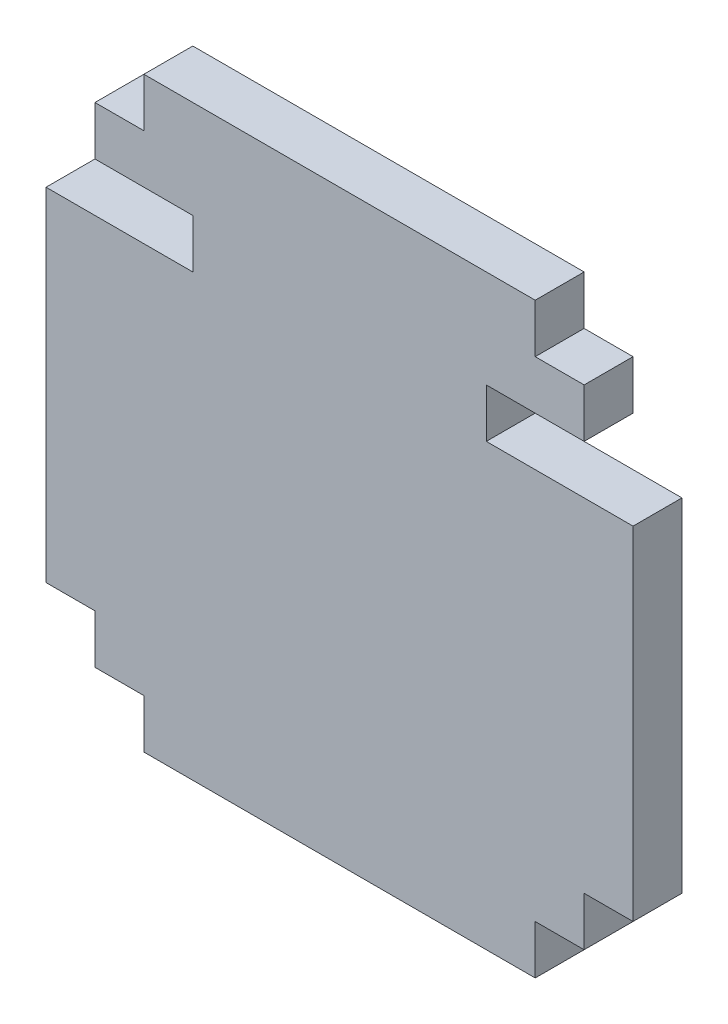
ISO-10303-21;
HEADER;
FILE_DESCRIPTION(('STEP AP214'),'2;1');
FILE_NAME('part.step','',(''),(''),'','','');
FILE_SCHEMA(('AUTOMOTIVE_DESIGN { 1 0 10303 214 1 1 1 1 }'));
ENDSEC;
DATA;
#1=APPLICATION_CONTEXT('core data for automotive mechanical design processes');
#2=APPLICATION_PROTOCOL_DEFINITION('international standard','automotive_design',2000,#1);
#3=PRODUCT_CONTEXT('',#1,'mechanical');
#4=PRODUCT('Part','Part','',(#3));
#5=PRODUCT_RELATED_PRODUCT_CATEGORY('part','',(#4));
#6=PRODUCT_DEFINITION_FORMATION('','',#4);
#7=PRODUCT_DEFINITION_CONTEXT('part definition',#1,'design');
#8=PRODUCT_DEFINITION('design','',#6,#7);
#9=PRODUCT_DEFINITION_SHAPE('','',#8);
#10=(LENGTH_UNIT() NAMED_UNIT(*) SI_UNIT(.MILLI.,.METRE.));
#11=(NAMED_UNIT(*) PLANE_ANGLE_UNIT() SI_UNIT($,.RADIAN.));
#12=(NAMED_UNIT(*) SI_UNIT($,.STERADIAN.) SOLID_ANGLE_UNIT());
#13=UNCERTAINTY_MEASURE_WITH_UNIT(LENGTH_MEASURE(1.E-05),#10,'distance_accuracy_value','');
#14=(GEOMETRIC_REPRESENTATION_CONTEXT(3) GLOBAL_UNCERTAINTY_ASSIGNED_CONTEXT((#13)) GLOBAL_UNIT_ASSIGNED_CONTEXT((#10,
#11,#12)) REPRESENTATION_CONTEXT('',''));
#15=CARTESIAN_POINT('',(0.,0.,0.));
#16=DIRECTION('',(0.,0.,1.));
#17=DIRECTION('',(1.,0.,0.));
#18=AXIS2_PLACEMENT_3D('',#15,#16,#17);
#19=CARTESIAN_POINT('',(0.,0.,0.));
#20=DIRECTION('',(0.,0.,1.));
#21=DIRECTION('',(1.,0.,0.));
#22=AXIS2_PLACEMENT_3D('',#19,#20,#21);
#23=PLANE('',#22);
#24=DIRECTION('',(0.,1.,0.));
#25=VECTOR('',#24,1.);
#26=CARTESIAN_POINT('',(-19.05,60.325,0.));
#27=LINE('',#26,#25);
#28=CARTESIAN_POINT('',(-19.05,53.975,0.));
#29=VERTEX_POINT('',#28);
#30=CARTESIAN_POINT('',(-19.05,60.325,0.));
#31=VERTEX_POINT('',#30);
#32=EDGE_CURVE('E205',#29,#31,#27,.T.);
#33=ORIENTED_EDGE('',*,*,#32,.T.);
#34=DIRECTION('',(-1.,0.,0.));
#35=VECTOR('',#34,1.);
#36=CARTESIAN_POINT('',(-38.1,60.325,0.));
#37=LINE('',#36,#35);
#38=CARTESIAN_POINT('',(-31.75,60.325,0.));
#39=VERTEX_POINT('',#38);
#40=EDGE_CURVE('E206',#31,#39,#37,.T.);
#41=ORIENTED_EDGE('',*,*,#40,.T.);
#42=DIRECTION('',(0.,-1.,0.));
#43=VECTOR('',#42,1.);
#44=CARTESIAN_POINT('',(-31.75,66.675,0.));
#45=LINE('',#44,#43);
#46=CARTESIAN_POINT('',(-31.75,66.675,0.));
#47=VERTEX_POINT('',#46);
#48=EDGE_CURVE('E220',#47,#39,#45,.T.);
#49=ORIENTED_EDGE('',*,*,#48,.F.);
#50=DIRECTION('',(-1.,0.,0.));
#51=VECTOR('',#50,1.);
#52=CARTESIAN_POINT('',(-25.4,66.675,0.));
#53=LINE('',#52,#51);
#54=CARTESIAN_POINT('',(-25.4,66.675,0.));
#55=VERTEX_POINT('',#54);
#56=EDGE_CURVE('E225',#55,#47,#53,.T.);
#57=ORIENTED_EDGE('',*,*,#56,.F.);
#58=DIRECTION('',(0.,-1.,0.));
#59=VECTOR('',#58,1.);
#60=CARTESIAN_POINT('',(-25.4,73.025,0.));
#61=LINE('',#60,#59);
#62=CARTESIAN_POINT('',(-25.4,73.025,0.));
#63=VERTEX_POINT('',#62);
#64=EDGE_CURVE('E356',#63,#55,#61,.T.);
#65=ORIENTED_EDGE('',*,*,#64,.F.);
#66=DIRECTION('',(-1.,0.,0.));
#67=VECTOR('',#66,1.);
#68=CARTESIAN_POINT('',(25.4,73.025,0.));
#69=LINE('',#68,#67);
#70=CARTESIAN_POINT('',(25.4,73.025,0.));
#71=VERTEX_POINT('',#70);
#72=EDGE_CURVE('E353',#71,#63,#69,.T.);
#73=ORIENTED_EDGE('',*,*,#72,.F.);
#74=DIRECTION('',(0.,1.,0.));
#75=VECTOR('',#74,1.);
#76=CARTESIAN_POINT('',(25.4,66.675,0.));
#77=LINE('',#76,#75);
#78=CARTESIAN_POINT('',(25.4,66.675,0.));
#79=VERTEX_POINT('',#78);
#80=EDGE_CURVE('E350',#79,#71,#77,.T.);
#81=ORIENTED_EDGE('',*,*,#80,.F.);
#82=DIRECTION('',(-1.,0.,0.));
#83=VECTOR('',#82,1.);
#84=CARTESIAN_POINT('',(31.75,66.675,0.));
#85=LINE('',#84,#83);
#86=CARTESIAN_POINT('',(31.75,66.675,0.));
#87=VERTEX_POINT('',#86);
#88=EDGE_CURVE('E347',#87,#79,#85,.T.);
#89=ORIENTED_EDGE('',*,*,#88,.F.);
#90=DIRECTION('',(0.,1.,0.));
#91=VECTOR('',#90,1.);
#92=CARTESIAN_POINT('',(31.75,60.325,0.));
#93=LINE('',#92,#91);
#94=CARTESIAN_POINT('',(31.75,60.325,0.));
#95=VERTEX_POINT('',#94);
#96=EDGE_CURVE('E344',#95,#87,#93,.T.);
#97=ORIENTED_EDGE('',*,*,#96,.F.);
#98=DIRECTION('',(-1.,0.,0.));
#99=VECTOR('',#98,1.);
#100=CARTESIAN_POINT('',(38.1,60.325,0.));
#101=LINE('',#100,#99);
#102=CARTESIAN_POINT('',(19.05,60.325,0.));
#103=VERTEX_POINT('',#102);
#104=EDGE_CURVE('E394',#95,#103,#101,.T.);
#105=ORIENTED_EDGE('',*,*,#104,.T.);
#106=DIRECTION('',(0.,-1.,0.));
#107=VECTOR('',#106,1.);
#108=CARTESIAN_POINT('',(19.05,60.325,0.));
#109=LINE('',#108,#107);
#110=CARTESIAN_POINT('',(19.05,53.975,0.));
#111=VERTEX_POINT('',#110);
#112=EDGE_CURVE('E421',#103,#111,#109,.T.);
#113=ORIENTED_EDGE('',*,*,#112,.T.);
#114=DIRECTION('',(1.,0.,0.));
#115=VECTOR('',#114,1.);
#116=CARTESIAN_POINT('',(19.05,53.975,0.));
#117=LINE('',#116,#115);
#118=CARTESIAN_POINT('',(38.1,53.975,0.));
#119=VERTEX_POINT('',#118);
#120=EDGE_CURVE('E412',#111,#119,#117,.T.);
#121=ORIENTED_EDGE('',*,*,#120,.T.);
#122=DIRECTION('',(0.,1.,0.));
#123=VECTOR('',#122,1.);
#124=CARTESIAN_POINT('',(38.1,9.52500000000001,0.));
#125=LINE('',#124,#123);
#126=CARTESIAN_POINT('',(38.1,9.52500000000001,0.));
#127=VERTEX_POINT('',#126);
#128=EDGE_CURVE('E341',#127,#119,#125,.T.);
#129=ORIENTED_EDGE('',*,*,#128,.F.);
#130=DIRECTION('',(1.,0.,0.));
#131=VECTOR('',#130,1.);
#132=CARTESIAN_POINT('',(31.75,9.52500000000001,0.));
#133=LINE('',#132,#131);
#134=CARTESIAN_POINT('',(31.75,9.52500000000001,0.));
#135=VERTEX_POINT('',#134);
#136=EDGE_CURVE('E338',#135,#127,#133,.T.);
#137=ORIENTED_EDGE('',*,*,#136,.F.);
#138=DIRECTION('',(0.,1.,0.));
#139=VECTOR('',#138,1.);
#140=CARTESIAN_POINT('',(31.75,3.175,0.));
#141=LINE('',#140,#139);
#142=CARTESIAN_POINT('',(31.75,3.175,0.));
#143=VERTEX_POINT('',#142);
#144=EDGE_CURVE('E335',#143,#135,#141,.T.);
#145=ORIENTED_EDGE('',*,*,#144,.F.);
#146=DIRECTION('',(1.,0.,0.));
#147=VECTOR('',#146,1.);
#148=CARTESIAN_POINT('',(25.4,3.175,0.));
#149=LINE('',#148,#147);
#150=CARTESIAN_POINT('',(25.4,3.175,0.));
#151=VERTEX_POINT('',#150);
#152=EDGE_CURVE('E332',#151,#143,#149,.T.);
#153=ORIENTED_EDGE('',*,*,#152,.F.);
#154=DIRECTION('',(0.,1.,0.));
#155=VECTOR('',#154,1.);
#156=CARTESIAN_POINT('',(25.4,-3.175,0.));
#157=LINE('',#156,#155);
#158=CARTESIAN_POINT('',(25.4,-3.175,0.));
#159=VERTEX_POINT('',#158);
#160=EDGE_CURVE('E329',#159,#151,#157,.T.);
#161=ORIENTED_EDGE('',*,*,#160,.F.);
#162=DIRECTION('',(1.,0.,0.));
#163=VECTOR('',#162,1.);
#164=CARTESIAN_POINT('',(-25.4,-3.175,0.));
#165=LINE('',#164,#163);
#166=CARTESIAN_POINT('',(-25.4,-3.175,0.));
#167=VERTEX_POINT('',#166);
#168=EDGE_CURVE('E325',#167,#159,#165,.T.);
#169=ORIENTED_EDGE('',*,*,#168,.F.);
#170=DIRECTION('',(0.,-1.,0.));
#171=VECTOR('',#170,1.);
#172=CARTESIAN_POINT('',(-25.4,-3.175,0.));
#173=LINE('',#172,#171);
#174=CARTESIAN_POINT('',(-25.4,3.175,0.));
#175=VERTEX_POINT('',#174);
#176=EDGE_CURVE('E322',#175,#167,#173,.T.);
#177=ORIENTED_EDGE('',*,*,#176,.F.);
#178=DIRECTION('',(1.,0.,0.));
#179=VECTOR('',#178,1.);
#180=CARTESIAN_POINT('',(-25.4,3.175,0.));
#181=LINE('',#180,#179);
#182=CARTESIAN_POINT('',(-31.75,3.175,0.));
#183=VERTEX_POINT('',#182);
#184=EDGE_CURVE('E231',#183,#175,#181,.T.);
#185=ORIENTED_EDGE('',*,*,#184,.F.);
#186=DIRECTION('',(0.,-1.,0.));
#187=VECTOR('',#186,1.);
#188=CARTESIAN_POINT('',(-31.75,3.175,0.));
#189=LINE('',#188,#187);
#190=CARTESIAN_POINT('',(-31.75,9.525,0.));
#191=VERTEX_POINT('',#190);
#192=EDGE_CURVE('E222',#191,#183,#189,.T.);
#193=ORIENTED_EDGE('',*,*,#192,.F.);
#194=DIRECTION('',(1.,0.,0.));
#195=VECTOR('',#194,1.);
#196=CARTESIAN_POINT('',(-31.75,9.525,0.));
#197=LINE('',#196,#195);
#198=CARTESIAN_POINT('',(-38.1,9.525,0.));
#199=VERTEX_POINT('',#198);
#200=EDGE_CURVE('E219',#199,#191,#197,.T.);
#201=ORIENTED_EDGE('',*,*,#200,.F.);
#202=DIRECTION('',(0.,-1.,0.));
#203=VECTOR('',#202,1.);
#204=CARTESIAN_POINT('',(-38.1,9.525,0.));
#205=LINE('',#204,#203);
#206=CARTESIAN_POINT('',(-38.1,53.975,0.));
#207=VERTEX_POINT('',#206);
#208=EDGE_CURVE('E212',#207,#199,#205,.T.);
#209=ORIENTED_EDGE('',*,*,#208,.F.);
#210=DIRECTION('',(1.,0.,0.));
#211=VECTOR('',#210,1.);
#212=CARTESIAN_POINT('',(-19.05,53.975,0.));
#213=LINE('',#212,#211);
#214=EDGE_CURVE('E198',#207,#29,#213,.T.);
#215=ORIENTED_EDGE('',*,*,#214,.T.);
#216=EDGE_LOOP('',(#33,#41,#49,#57,#65,#73,#81,#89,#97,#105,#113,#121,#129,#137,#145,#153,#161,
#169,#177,#185,#193,#201,#209,#215));
#217=FACE_BOUND('',#216,.T.);
#218=ADVANCED_FACE('F33',(#217),#23,.F.);
#219=CARTESIAN_POINT('',(-25.4,3.175,114.11307345283));
#220=DIRECTION('',(0.,1.,0.));
#221=DIRECTION('',(0.,0.,1.));
#222=AXIS2_PLACEMENT_3D('',#219,#220,#221);
#223=PLANE('',#222);
#224=DIRECTION('',(0.,0.,-1.));
#225=VECTOR('',#224,1.);
#226=CARTESIAN_POINT('',(-25.4,3.175,114.11307345283));
#227=LINE('',#226,#225);
#228=CARTESIAN_POINT('',(-25.4,3.175,6.35000000000002));
#229=VERTEX_POINT('',#228);
#230=EDGE_CURVE('E234',#229,#175,#227,.T.);
#231=ORIENTED_EDGE('',*,*,#230,.F.);
#232=DIRECTION('',(-1.,0.,0.));
#233=VECTOR('',#232,1.);
#234=CARTESIAN_POINT('',(-25.4,3.175,6.35000000000002));
#235=LINE('',#234,#233);
#236=CARTESIAN_POINT('',(-31.75,3.175,6.35000000000005));
#237=VERTEX_POINT('',#236);
#238=EDGE_CURVE('E270',#229,#237,#235,.T.);
#239=ORIENTED_EDGE('',*,*,#238,.T.);
#240=DIRECTION('',(0.,0.,-1.));
#241=VECTOR('',#240,1.);
#242=CARTESIAN_POINT('',(-31.75,3.175,114.11307345283));
#243=LINE('',#242,#241);
#244=EDGE_CURVE('E236',#237,#183,#243,.T.);
#245=ORIENTED_EDGE('',*,*,#244,.T.);
#246=ORIENTED_EDGE('',*,*,#184,.T.);
#247=EDGE_LOOP('',(#231,#239,#245,#246));
#248=FACE_BOUND('',#247,.T.);
#249=ADVANCED_FACE('F450',(#248),#223,.F.);
#250=CARTESIAN_POINT('',(-31.75,3.175,114.11307345283));
#251=DIRECTION('',(1.,0.,0.));
#252=DIRECTION('',(0.,0.,-1.));
#253=AXIS2_PLACEMENT_3D('',#250,#251,#252);
#254=PLANE('',#253);
#255=ORIENTED_EDGE('',*,*,#244,.F.);
#256=DIRECTION('',(0.,1.,0.));
#257=VECTOR('',#256,1.);
#258=CARTESIAN_POINT('',(-31.75,3.175,6.35000000000002));
#259=LINE('',#258,#257);
#260=CARTESIAN_POINT('',(-31.75,9.525,6.35000000000002));
#261=VERTEX_POINT('',#260);
#262=EDGE_CURVE('E272',#237,#261,#259,.T.);
#263=ORIENTED_EDGE('',*,*,#262,.T.);
#264=DIRECTION('',(0.,0.,-1.));
#265=VECTOR('',#264,1.);
#266=CARTESIAN_POINT('',(-31.75,9.525,114.11307345283));
#267=LINE('',#266,#265);
#268=EDGE_CURVE('E238',#261,#191,#267,.T.);
#269=ORIENTED_EDGE('',*,*,#268,.T.);
#270=ORIENTED_EDGE('',*,*,#192,.T.);
#271=EDGE_LOOP('',(#255,#263,#269,#270));
#272=FACE_BOUND('',#271,.T.);
#273=ADVANCED_FACE('F457',(#272),#254,.F.);
#274=CARTESIAN_POINT('',(-31.75,9.525,114.11307345283));
#275=DIRECTION('',(0.,1.,0.));
#276=DIRECTION('',(0.,0.,1.));
#277=AXIS2_PLACEMENT_3D('',#274,#275,#276);
#278=PLANE('',#277);
#279=ORIENTED_EDGE('',*,*,#268,.F.);
#280=DIRECTION('',(-1.,0.,0.));
#281=VECTOR('',#280,1.);
#282=CARTESIAN_POINT('',(-31.75,9.525,6.35000000000002));
#283=LINE('',#282,#281);
#284=CARTESIAN_POINT('',(-38.1,9.525,6.35000000000002));
#285=VERTEX_POINT('',#284);
#286=EDGE_CURVE('E57',#261,#285,#283,.T.);
#287=ORIENTED_EDGE('',*,*,#286,.T.);
#288=DIRECTION('',(0.,0.,-1.));
#289=VECTOR('',#288,1.);
#290=CARTESIAN_POINT('',(-38.1,9.525,114.11307345283));
#291=LINE('',#290,#289);
#292=EDGE_CURVE('E240',#285,#199,#291,.T.);
#293=ORIENTED_EDGE('',*,*,#292,.T.);
#294=ORIENTED_EDGE('',*,*,#200,.T.);
#295=EDGE_LOOP('',(#279,#287,#293,#294));
#296=FACE_BOUND('',#295,.T.);
#297=ADVANCED_FACE('F464',(#296),#278,.F.);
#298=CARTESIAN_POINT('',(-38.1,9.525,114.11307345283));
#299=DIRECTION('',(1.,0.,0.));
#300=DIRECTION('',(0.,0.,-1.));
#301=AXIS2_PLACEMENT_3D('',#298,#299,#300);
#302=PLANE('',#301);
#303=DIRECTION('',(0.,1.,0.));
#304=VECTOR('',#303,1.);
#305=CARTESIAN_POINT('',(-38.1,9.525,6.35000000000002));
#306=LINE('',#305,#304);
#307=CARTESIAN_POINT('',(-38.1,53.975,6.35000000000002));
#308=VERTEX_POINT('',#307);
#309=EDGE_CURVE('E214',#285,#308,#306,.T.);
#310=ORIENTED_EDGE('',*,*,#309,.T.);
#311=DIRECTION('',(0.,0.,1.));
#312=VECTOR('',#311,1.);
#313=CARTESIAN_POINT('',(-38.1,53.975,0.));
#314=LINE('',#313,#312);
#315=EDGE_CURVE('E48',#207,#308,#314,.T.);
#316=ORIENTED_EDGE('',*,*,#315,.F.);
#317=ORIENTED_EDGE('',*,*,#208,.T.);
#318=ORIENTED_EDGE('',*,*,#292,.F.);
#319=EDGE_LOOP('',(#310,#316,#317,#318));
#320=FACE_BOUND('',#319,.T.);
#321=ADVANCED_FACE('F210',(#320),#302,.F.);
#322=CARTESIAN_POINT('',(-31.75,66.675,114.11307345283));
#323=DIRECTION('',(1.,0.,0.));
#324=DIRECTION('',(0.,0.,-1.));
#325=AXIS2_PLACEMENT_3D('',#322,#323,#324);
#326=PLANE('',#325);
#327=DIRECTION('',(0.,0.,-1.));
#328=VECTOR('',#327,1.);
#329=CARTESIAN_POINT('',(-31.75,60.325,114.11307345283));
#330=LINE('',#329,#328);
#331=CARTESIAN_POINT('',(-31.75,60.325,6.35000000000002));
#332=VERTEX_POINT('',#331);
#333=EDGE_CURVE('E242',#332,#39,#330,.T.);
#334=ORIENTED_EDGE('',*,*,#333,.F.);
#335=DIRECTION('',(0.,1.,0.));
#336=VECTOR('',#335,1.);
#337=CARTESIAN_POINT('',(-31.75,66.675,6.35000000000002));
#338=LINE('',#337,#336);
#339=CARTESIAN_POINT('',(-31.75,66.675,6.35000000000002));
#340=VERTEX_POINT('',#339);
#341=EDGE_CURVE('E285',#332,#340,#338,.T.);
#342=ORIENTED_EDGE('',*,*,#341,.T.);
#343=DIRECTION('',(0.,0.,-1.));
#344=VECTOR('',#343,1.);
#345=CARTESIAN_POINT('',(-31.75,66.675,114.11307345283));
#346=LINE('',#345,#344);
#347=EDGE_CURVE('E244',#340,#47,#346,.T.);
#348=ORIENTED_EDGE('',*,*,#347,.T.);
#349=ORIENTED_EDGE('',*,*,#48,.T.);
#350=EDGE_LOOP('',(#334,#342,#348,#349));
#351=FACE_BOUND('',#350,.T.);
#352=ADVANCED_FACE('F370',(#351),#326,.F.);
#353=CARTESIAN_POINT('',(-25.4,66.675,114.11307345283));
#354=DIRECTION('',(0.,-1.,0.));
#355=DIRECTION('',(0.,0.,-1.));
#356=AXIS2_PLACEMENT_3D('',#353,#354,#355);
#357=PLANE('',#356);
#358=ORIENTED_EDGE('',*,*,#347,.F.);
#359=DIRECTION('',(1.,0.,0.));
#360=VECTOR('',#359,1.);
#361=CARTESIAN_POINT('',(-25.4,66.675,6.35000000000002));
#362=LINE('',#361,#360);
#363=CARTESIAN_POINT('',(-25.4,66.675,6.35000000000002));
#364=VERTEX_POINT('',#363);
#365=EDGE_CURVE('E288',#340,#364,#362,.T.);
#366=ORIENTED_EDGE('',*,*,#365,.T.);
#367=DIRECTION('',(0.,0.,-1.));
#368=VECTOR('',#367,1.);
#369=CARTESIAN_POINT('',(-25.4,66.675,114.11307345283));
#370=LINE('',#369,#368);
#371=EDGE_CURVE('E246',#364,#55,#370,.T.);
#372=ORIENTED_EDGE('',*,*,#371,.T.);
#373=ORIENTED_EDGE('',*,*,#56,.T.);
#374=EDGE_LOOP('',(#358,#366,#372,#373));
#375=FACE_BOUND('',#374,.T.);
#376=ADVANCED_FACE('F363',(#375),#357,.F.);
#377=CARTESIAN_POINT('',(-25.4,73.025,114.11307345283));
#378=DIRECTION('',(1.,0.,0.));
#379=DIRECTION('',(0.,0.,-1.));
#380=AXIS2_PLACEMENT_3D('',#377,#378,#379);
#381=PLANE('',#380);
#382=ORIENTED_EDGE('',*,*,#371,.F.);
#383=DIRECTION('',(0.,1.,0.));
#384=VECTOR('',#383,1.);
#385=CARTESIAN_POINT('',(-25.4,73.025,6.35000000000002));
#386=LINE('',#385,#384);
#387=CARTESIAN_POINT('',(-25.4,73.025,6.35000000000002));
#388=VERTEX_POINT('',#387);
#389=EDGE_CURVE('E291',#364,#388,#386,.T.);
#390=ORIENTED_EDGE('',*,*,#389,.T.);
#391=DIRECTION('',(0.,0.,-1.));
#392=VECTOR('',#391,1.);
#393=CARTESIAN_POINT('',(-25.4,73.025,114.11307345283));
#394=LINE('',#393,#392);
#395=EDGE_CURVE('E248',#388,#63,#394,.T.);
#396=ORIENTED_EDGE('',*,*,#395,.T.);
#397=ORIENTED_EDGE('',*,*,#64,.T.);
#398=EDGE_LOOP('',(#382,#390,#396,#397));
#399=FACE_BOUND('',#398,.T.);
#400=ADVANCED_FACE('F378',(#399),#381,.F.);
#401=CARTESIAN_POINT('',(25.4,73.025,114.11307345283));
#402=DIRECTION('',(0.,-1.,0.));
#403=DIRECTION('',(0.,0.,-1.));
#404=AXIS2_PLACEMENT_3D('',#401,#402,#403);
#405=PLANE('',#404);
#406=ORIENTED_EDGE('',*,*,#395,.F.);
#407=DIRECTION('',(1.,0.,0.));
#408=VECTOR('',#407,1.);
#409=CARTESIAN_POINT('',(25.4,73.025,6.35000000000002));
#410=LINE('',#409,#408);
#411=CARTESIAN_POINT('',(25.4,73.025,6.35000000000002));
#412=VERTEX_POINT('',#411);
#413=EDGE_CURVE('E294',#388,#412,#410,.T.);
#414=ORIENTED_EDGE('',*,*,#413,.T.);
#415=DIRECTION('',(0.,0.,-1.));
#416=VECTOR('',#415,1.);
#417=CARTESIAN_POINT('',(25.4,73.025,114.11307345283));
#418=LINE('',#417,#416);
#419=EDGE_CURVE('E250',#412,#71,#418,.T.);
#420=ORIENTED_EDGE('',*,*,#419,.T.);
#421=ORIENTED_EDGE('',*,*,#72,.T.);
#422=EDGE_LOOP('',(#406,#414,#420,#421));
#423=FACE_BOUND('',#422,.T.);
#424=ADVANCED_FACE('F383',(#423),#405,.F.);
#425=CARTESIAN_POINT('',(25.4,66.675,114.11307345283));
#426=DIRECTION('',(-1.,0.,0.));
#427=DIRECTION('',(0.,-1.,0.));
#428=AXIS2_PLACEMENT_3D('',#425,#426,#427);
#429=PLANE('',#428);
#430=ORIENTED_EDGE('',*,*,#419,.F.);
#431=DIRECTION('',(0.,-1.,0.));
#432=VECTOR('',#431,1.);
#433=CARTESIAN_POINT('',(25.4,66.675,6.35000000000002));
#434=LINE('',#433,#432);
#435=CARTESIAN_POINT('',(25.4,66.675,6.35000000000002));
#436=VERTEX_POINT('',#435);
#437=EDGE_CURVE('E297',#412,#436,#434,.T.);
#438=ORIENTED_EDGE('',*,*,#437,.T.);
#439=DIRECTION('',(0.,0.,-1.));
#440=VECTOR('',#439,1.);
#441=CARTESIAN_POINT('',(25.4,66.675,114.11307345283));
#442=LINE('',#441,#440);
#443=EDGE_CURVE('E252',#436,#79,#442,.T.);
#444=ORIENTED_EDGE('',*,*,#443,.T.);
#445=ORIENTED_EDGE('',*,*,#80,.T.);
#446=EDGE_LOOP('',(#430,#438,#444,#445));
#447=FACE_BOUND('',#446,.T.);
#448=ADVANCED_FACE('F386',(#447),#429,.F.);
#449=CARTESIAN_POINT('',(31.75,66.675,114.11307345283));
#450=DIRECTION('',(0.,-1.,0.));
#451=DIRECTION('',(0.,0.,-1.));
#452=AXIS2_PLACEMENT_3D('',#449,#450,#451);
#453=PLANE('',#452);
#454=ORIENTED_EDGE('',*,*,#443,.F.);
#455=DIRECTION('',(1.,0.,0.));
#456=VECTOR('',#455,1.);
#457=CARTESIAN_POINT('',(31.75,66.675,6.35000000000002));
#458=LINE('',#457,#456);
#459=CARTESIAN_POINT('',(31.75,66.675,6.35000000000002));
#460=VERTEX_POINT('',#459);
#461=EDGE_CURVE('E300',#436,#460,#458,.T.);
#462=ORIENTED_EDGE('',*,*,#461,.T.);
#463=DIRECTION('',(0.,0.,-1.));
#464=VECTOR('',#463,1.);
#465=CARTESIAN_POINT('',(31.75,66.675,114.11307345283));
#466=LINE('',#465,#464);
#467=EDGE_CURVE('E254',#460,#87,#466,.T.);
#468=ORIENTED_EDGE('',*,*,#467,.T.);
#469=ORIENTED_EDGE('',*,*,#88,.T.);
#470=EDGE_LOOP('',(#454,#462,#468,#469));
#471=FACE_BOUND('',#470,.T.);
#472=ADVANCED_FACE('F389',(#471),#453,.F.);
#473=CARTESIAN_POINT('',(31.75,60.325,114.11307345283));
#474=DIRECTION('',(-1.,0.,0.));
#475=DIRECTION('',(0.,0.,1.));
#476=AXIS2_PLACEMENT_3D('',#473,#474,#475);
#477=PLANE('',#476);
#478=ORIENTED_EDGE('',*,*,#467,.F.);
#479=DIRECTION('',(0.,-1.,0.));
#480=VECTOR('',#479,1.);
#481=CARTESIAN_POINT('',(31.75,60.325,6.35000000000002));
#482=LINE('',#481,#480);
#483=CARTESIAN_POINT('',(31.75,60.325,6.35000000000002));
#484=VERTEX_POINT('',#483);
#485=EDGE_CURVE('E303',#460,#484,#482,.T.);
#486=ORIENTED_EDGE('',*,*,#485,.T.);
#487=DIRECTION('',(0.,0.,-1.));
#488=VECTOR('',#487,1.);
#489=CARTESIAN_POINT('',(31.75,60.325,114.11307345283));
#490=LINE('',#489,#488);
#491=EDGE_CURVE('E256',#484,#95,#490,.T.);
#492=ORIENTED_EDGE('',*,*,#491,.T.);
#493=ORIENTED_EDGE('',*,*,#96,.T.);
#494=EDGE_LOOP('',(#478,#486,#492,#493));
#495=FACE_BOUND('',#494,.T.);
#496=ADVANCED_FACE('F396',(#495),#477,.F.);
#497=CARTESIAN_POINT('',(38.1,9.52500000000001,114.11307345283));
#498=DIRECTION('',(-1.,0.,0.));
#499=DIRECTION('',(0.,0.,1.));
#500=AXIS2_PLACEMENT_3D('',#497,#498,#499);
#501=PLANE('',#500);
#502=ORIENTED_EDGE('',*,*,#128,.T.);
#503=DIRECTION('',(0.,0.,1.));
#504=VECTOR('',#503,1.);
#505=CARTESIAN_POINT('',(38.1,53.975,0.));
#506=LINE('',#505,#504);
#507=CARTESIAN_POINT('',(38.1,53.975,6.35000000000002));
#508=VERTEX_POINT('',#507);
#509=EDGE_CURVE('E326',#119,#508,#506,.T.);
#510=ORIENTED_EDGE('',*,*,#509,.T.);
#511=DIRECTION('',(0.,-1.,0.));
#512=VECTOR('',#511,1.);
#513=CARTESIAN_POINT('',(38.1,9.52500000000001,6.35000000000002));
#514=LINE('',#513,#512);
#515=CARTESIAN_POINT('',(38.1,9.52500000000001,6.35000000000002));
#516=VERTEX_POINT('',#515);
#517=EDGE_CURVE('E306',#508,#516,#514,.T.);
#518=ORIENTED_EDGE('',*,*,#517,.T.);
#519=DIRECTION('',(0.,0.,-1.));
#520=VECTOR('',#519,1.);
#521=CARTESIAN_POINT('',(38.1,9.52500000000001,114.11307345283));
#522=LINE('',#521,#520);
#523=EDGE_CURVE('E259',#516,#127,#522,.T.);
#524=ORIENTED_EDGE('',*,*,#523,.T.);
#525=EDGE_LOOP('',(#502,#510,#518,#524));
#526=FACE_BOUND('',#525,.T.);
#527=ADVANCED_FACE('F483',(#526),#501,.F.);
#528=CARTESIAN_POINT('',(31.75,9.52500000000001,114.11307345283));
#529=DIRECTION('',(0.,1.,0.));
#530=DIRECTION('',(0.,0.,1.));
#531=AXIS2_PLACEMENT_3D('',#528,#529,#530);
#532=PLANE('',#531);
#533=ORIENTED_EDGE('',*,*,#523,.F.);
#534=DIRECTION('',(-1.,0.,0.));
#535=VECTOR('',#534,1.);
#536=CARTESIAN_POINT('',(31.75,9.52500000000001,6.35000000000002));
#537=LINE('',#536,#535);
#538=CARTESIAN_POINT('',(31.75,9.52500000000001,6.35000000000002));
#539=VERTEX_POINT('',#538);
#540=EDGE_CURVE('E308',#516,#539,#537,.T.);
#541=ORIENTED_EDGE('',*,*,#540,.T.);
#542=DIRECTION('',(0.,0.,-1.));
#543=VECTOR('',#542,1.);
#544=CARTESIAN_POINT('',(31.75,9.52500000000001,114.11307345283));
#545=LINE('',#544,#543);
#546=EDGE_CURVE('E261',#539,#135,#545,.T.);
#547=ORIENTED_EDGE('',*,*,#546,.T.);
#548=ORIENTED_EDGE('',*,*,#136,.T.);
#549=EDGE_LOOP('',(#533,#541,#547,#548));
#550=FACE_BOUND('',#549,.T.);
#551=ADVANCED_FACE('F486',(#550),#532,.F.);
#552=CARTESIAN_POINT('',(31.75,3.175,114.11307345283));
#553=DIRECTION('',(-1.,0.,0.));
#554=DIRECTION('',(0.,0.,1.));
#555=AXIS2_PLACEMENT_3D('',#552,#553,#554);
#556=PLANE('',#555);
#557=ORIENTED_EDGE('',*,*,#546,.F.);
#558=DIRECTION('',(0.,-1.,0.));
#559=VECTOR('',#558,1.);
#560=CARTESIAN_POINT('',(31.75,3.175,6.35000000000002));
#561=LINE('',#560,#559);
#562=CARTESIAN_POINT('',(31.75,3.175,6.35000000000002));
#563=VERTEX_POINT('',#562);
#564=EDGE_CURVE('E311',#539,#563,#561,.T.);
#565=ORIENTED_EDGE('',*,*,#564,.T.);
#566=DIRECTION('',(0.,0.,-1.));
#567=VECTOR('',#566,1.);
#568=CARTESIAN_POINT('',(31.75,3.175,114.11307345283));
#569=LINE('',#568,#567);
#570=EDGE_CURVE('E263',#563,#143,#569,.T.);
#571=ORIENTED_EDGE('',*,*,#570,.T.);
#572=ORIENTED_EDGE('',*,*,#144,.T.);
#573=EDGE_LOOP('',(#557,#565,#571,#572));
#574=FACE_BOUND('',#573,.T.);
#575=ADVANCED_FACE('F490',(#574),#556,.F.);
#576=CARTESIAN_POINT('',(25.4,3.175,114.11307345283));
#577=DIRECTION('',(0.,1.,0.));
#578=DIRECTION('',(0.,0.,1.));
#579=AXIS2_PLACEMENT_3D('',#576,#577,#578);
#580=PLANE('',#579);
#581=ORIENTED_EDGE('',*,*,#570,.F.);
#582=DIRECTION('',(-1.,0.,0.));
#583=VECTOR('',#582,1.);
#584=CARTESIAN_POINT('',(25.4,3.175,6.35000000000002));
#585=LINE('',#584,#583);
#586=CARTESIAN_POINT('',(25.4,3.175,6.35000000000002));
#587=VERTEX_POINT('',#586);
#588=EDGE_CURVE('E314',#563,#587,#585,.T.);
#589=ORIENTED_EDGE('',*,*,#588,.T.);
#590=DIRECTION('',(0.,0.,-1.));
#591=VECTOR('',#590,1.);
#592=CARTESIAN_POINT('',(25.4,3.175,114.11307345283));
#593=LINE('',#592,#591);
#594=EDGE_CURVE('E265',#587,#151,#593,.T.);
#595=ORIENTED_EDGE('',*,*,#594,.T.);
#596=ORIENTED_EDGE('',*,*,#152,.T.);
#597=EDGE_LOOP('',(#581,#589,#595,#596));
#598=FACE_BOUND('',#597,.T.);
#599=ADVANCED_FACE('F494',(#598),#580,.F.);
#600=CARTESIAN_POINT('',(25.4,-3.175,114.11307345283));
#601=DIRECTION('',(-1.,0.,0.));
#602=DIRECTION('',(0.,0.,1.));
#603=AXIS2_PLACEMENT_3D('',#600,#601,#602);
#604=PLANE('',#603);
#605=ORIENTED_EDGE('',*,*,#594,.F.);
#606=DIRECTION('',(0.,-1.,0.));
#607=VECTOR('',#606,1.);
#608=CARTESIAN_POINT('',(25.4,-3.175,6.35000000000002));
#609=LINE('',#608,#607);
#610=CARTESIAN_POINT('',(25.4,-3.175,6.35000000000002));
#611=VERTEX_POINT('',#610);
#612=EDGE_CURVE('E317',#587,#611,#609,.T.);
#613=ORIENTED_EDGE('',*,*,#612,.T.);
#614=DIRECTION('',(0.,0.,-1.));
#615=VECTOR('',#614,1.);
#616=CARTESIAN_POINT('',(25.4,-3.175,114.11307345283));
#617=LINE('',#616,#615);
#618=EDGE_CURVE('E267',#611,#159,#617,.T.);
#619=ORIENTED_EDGE('',*,*,#618,.T.);
#620=ORIENTED_EDGE('',*,*,#160,.T.);
#621=EDGE_LOOP('',(#605,#613,#619,#620));
#622=FACE_BOUND('',#621,.T.);
#623=ADVANCED_FACE('F498',(#622),#604,.F.);
#624=CARTESIAN_POINT('',(-25.4,-3.175,114.11307345283));
#625=DIRECTION('',(0.,1.,0.));
#626=DIRECTION('',(0.,0.,1.));
#627=AXIS2_PLACEMENT_3D('',#624,#625,#626);
#628=PLANE('',#627);
#629=ORIENTED_EDGE('',*,*,#618,.F.);
#630=DIRECTION('',(-1.,0.,0.));
#631=VECTOR('',#630,1.);
#632=CARTESIAN_POINT('',(-25.4,-3.175,6.35000000000002));
#633=LINE('',#632,#631);
#634=CARTESIAN_POINT('',(-25.4,-3.175,6.35000000000002));
#635=VERTEX_POINT('',#634);
#636=EDGE_CURVE('E101',#611,#635,#633,.T.);
#637=ORIENTED_EDGE('',*,*,#636,.T.);
#638=DIRECTION('',(0.,0.,-1.));
#639=VECTOR('',#638,1.);
#640=CARTESIAN_POINT('',(-25.4,-3.175,114.11307345283));
#641=LINE('',#640,#639);
#642=EDGE_CURVE('E269',#635,#167,#641,.T.);
#643=ORIENTED_EDGE('',*,*,#642,.T.);
#644=ORIENTED_EDGE('',*,*,#168,.T.);
#645=EDGE_LOOP('',(#629,#637,#643,#644));
#646=FACE_BOUND('',#645,.T.);
#647=ADVANCED_FACE('F501',(#646),#628,.F.);
#648=CARTESIAN_POINT('',(-25.4,-3.175,114.11307345283));
#649=DIRECTION('',(1.,0.,0.));
#650=DIRECTION('',(0.,0.,-1.));
#651=AXIS2_PLACEMENT_3D('',#648,#649,#650);
#652=PLANE('',#651);
#653=ORIENTED_EDGE('',*,*,#642,.F.);
#654=DIRECTION('',(0.,1.,0.));
#655=VECTOR('',#654,1.);
#656=CARTESIAN_POINT('',(-25.4,-3.175,6.35000000000002));
#657=LINE('',#656,#655);
#658=EDGE_CURVE('E41',#635,#229,#657,.T.);
#659=ORIENTED_EDGE('',*,*,#658,.T.);
#660=ORIENTED_EDGE('',*,*,#230,.T.);
#661=ORIENTED_EDGE('',*,*,#176,.T.);
#662=EDGE_LOOP('',(#653,#659,#660,#661));
#663=FACE_BOUND('',#662,.T.);
#664=ADVANCED_FACE('F35',(#663),#652,.F.);
#665=CARTESIAN_POINT('',(-38.1,3.175,6.35000000000002));
#666=DIRECTION('',(0.,0.,-1.));
#667=DIRECTION('',(-1.,0.,0.));
#668=AXIS2_PLACEMENT_3D('',#665,#666,#667);
#669=PLANE('',#668);
#670=ORIENTED_EDGE('',*,*,#341,.F.);
#671=DIRECTION('',(-1.,0.,0.));
#672=VECTOR('',#671,1.);
#673=CARTESIAN_POINT('',(-38.1,60.325,6.35000000000002));
#674=LINE('',#673,#672);
#675=CARTESIAN_POINT('',(-19.05,60.325,6.35000000000002));
#676=VERTEX_POINT('',#675);
#677=EDGE_CURVE('E375',#676,#332,#674,.T.);
#678=ORIENTED_EDGE('',*,*,#677,.F.);
#679=DIRECTION('',(0.,1.,0.));
#680=VECTOR('',#679,1.);
#681=CARTESIAN_POINT('',(-19.05,60.325,6.35000000000002));
#682=LINE('',#681,#680);
#683=CARTESIAN_POINT('',(-19.05,53.975,6.35000000000002));
#684=VERTEX_POINT('',#683);
#685=EDGE_CURVE('E426',#684,#676,#682,.T.);
#686=ORIENTED_EDGE('',*,*,#685,.F.);
#687=DIRECTION('',(1.,0.,0.));
#688=VECTOR('',#687,1.);
#689=CARTESIAN_POINT('',(-19.05,53.975,6.35000000000002));
#690=LINE('',#689,#688);
#691=EDGE_CURVE('E429',#308,#684,#690,.T.);
#692=ORIENTED_EDGE('',*,*,#691,.F.);
#693=ORIENTED_EDGE('',*,*,#309,.F.);
#694=ORIENTED_EDGE('',*,*,#286,.F.);
#695=ORIENTED_EDGE('',*,*,#262,.F.);
#696=ORIENTED_EDGE('',*,*,#238,.F.);
#697=ORIENTED_EDGE('',*,*,#658,.F.);
#698=ORIENTED_EDGE('',*,*,#636,.F.);
#699=ORIENTED_EDGE('',*,*,#612,.F.);
#700=ORIENTED_EDGE('',*,*,#588,.F.);
#701=ORIENTED_EDGE('',*,*,#564,.F.);
#702=ORIENTED_EDGE('',*,*,#540,.F.);
#703=ORIENTED_EDGE('',*,*,#517,.F.);
#704=DIRECTION('',(1.,0.,0.));
#705=VECTOR('',#704,1.);
#706=CARTESIAN_POINT('',(19.05,53.975,6.35000000000002));
#707=LINE('',#706,#705);
#708=CARTESIAN_POINT('',(19.05,53.975,6.35000000000002));
#709=VERTEX_POINT('',#708);
#710=EDGE_CURVE('E405',#709,#508,#707,.T.);
#711=ORIENTED_EDGE('',*,*,#710,.F.);
#712=DIRECTION('',(0.,-1.,0.));
#713=VECTOR('',#712,1.);
#714=CARTESIAN_POINT('',(19.05,60.325,6.35000000000002));
#715=LINE('',#714,#713);
#716=CARTESIAN_POINT('',(19.05,60.325,6.35000000000002));
#717=VERTEX_POINT('',#716);
#718=EDGE_CURVE('E403',#717,#709,#715,.T.);
#719=ORIENTED_EDGE('',*,*,#718,.F.);
#720=DIRECTION('',(1.,0.,0.));
#721=VECTOR('',#720,1.);
#722=CARTESIAN_POINT('',(-38.1,60.325,6.35000000000002));
#723=LINE('',#722,#721);
#724=EDGE_CURVE('E11',#717,#484,#723,.T.);
#725=ORIENTED_EDGE('',*,*,#724,.T.);
#726=ORIENTED_EDGE('',*,*,#485,.F.);
#727=ORIENTED_EDGE('',*,*,#461,.F.);
#728=ORIENTED_EDGE('',*,*,#437,.F.);
#729=ORIENTED_EDGE('',*,*,#413,.F.);
#730=ORIENTED_EDGE('',*,*,#389,.F.);
#731=ORIENTED_EDGE('',*,*,#365,.F.);
#732=EDGE_LOOP('',(#670,#678,#686,#692,#693,#694,#695,#696,#697,#698,#699,#700,#701,#702,#703,
#711,#719,#725,#726,#727,#728,#729,#730,#731));
#733=FACE_BOUND('',#732,.T.);
#734=ADVANCED_FACE('F373',(#733),#669,.F.);
#735=CARTESIAN_POINT('',(38.1,60.325,0.));
#736=DIRECTION('',(0.,1.,0.));
#737=DIRECTION('',(-1.,0.,0.));
#738=AXIS2_PLACEMENT_3D('',#735,#736,#737);
#739=PLANE('',#738);
#740=ORIENTED_EDGE('',*,*,#724,.F.);
#741=DIRECTION('',(0.,0.,1.));
#742=VECTOR('',#741,1.);
#743=CARTESIAN_POINT('',(19.05,60.325,0.));
#744=LINE('',#743,#742);
#745=EDGE_CURVE('E281',#103,#717,#744,.T.);
#746=ORIENTED_EDGE('',*,*,#745,.F.);
#747=ORIENTED_EDGE('',*,*,#104,.F.);
#748=ORIENTED_EDGE('',*,*,#491,.F.);
#749=EDGE_LOOP('',(#740,#746,#747,#748));
#750=FACE_BOUND('',#749,.T.);
#751=ADVANCED_FACE('F398',(#750),#739,.F.);
#752=CARTESIAN_POINT('',(19.05,53.975,0.));
#753=DIRECTION('',(0.,-1.,0.));
#754=DIRECTION('',(0.,0.,-1.));
#755=AXIS2_PLACEMENT_3D('',#752,#753,#754);
#756=PLANE('',#755);
#757=ORIENTED_EDGE('',*,*,#710,.T.);
#758=ORIENTED_EDGE('',*,*,#509,.F.);
#759=ORIENTED_EDGE('',*,*,#120,.F.);
#760=DIRECTION('',(0.,0.,1.));
#761=VECTOR('',#760,1.);
#762=CARTESIAN_POINT('',(19.05,53.975,0.));
#763=LINE('',#762,#761);
#764=EDGE_CURVE('E416',#111,#709,#763,.T.);
#765=ORIENTED_EDGE('',*,*,#764,.T.);
#766=EDGE_LOOP('',(#757,#758,#759,#765));
#767=FACE_BOUND('',#766,.T.);
#768=ADVANCED_FACE('F445',(#767),#756,.F.);
#769=CARTESIAN_POINT('',(19.05,60.325,0.));
#770=DIRECTION('',(-1.,0.,0.));
#771=DIRECTION('',(0.,0.,1.));
#772=AXIS2_PLACEMENT_3D('',#769,#770,#771);
#773=PLANE('',#772);
#774=ORIENTED_EDGE('',*,*,#718,.T.);
#775=ORIENTED_EDGE('',*,*,#764,.F.);
#776=ORIENTED_EDGE('',*,*,#112,.F.);
#777=ORIENTED_EDGE('',*,*,#745,.T.);
#778=EDGE_LOOP('',(#774,#775,#776,#777));
#779=FACE_BOUND('',#778,.T.);
#780=ADVANCED_FACE('F438',(#779),#773,.F.);
#781=CARTESIAN_POINT('',(-38.1,60.325,0.));
#782=DIRECTION('',(0.,1.,0.));
#783=DIRECTION('',(-1.,0.,0.));
#784=AXIS2_PLACEMENT_3D('',#781,#782,#783);
#785=PLANE('',#784);
#786=ORIENTED_EDGE('',*,*,#40,.F.);
#787=DIRECTION('',(0.,0.,1.));
#788=VECTOR('',#787,1.);
#789=CARTESIAN_POINT('',(-19.05,60.325,0.));
#790=LINE('',#789,#788);
#791=EDGE_CURVE('E407',#31,#676,#790,.T.);
#792=ORIENTED_EDGE('',*,*,#791,.T.);
#793=ORIENTED_EDGE('',*,*,#677,.T.);
#794=ORIENTED_EDGE('',*,*,#333,.T.);
#795=EDGE_LOOP('',(#786,#792,#793,#794));
#796=FACE_BOUND('',#795,.T.);
#797=ADVANCED_FACE('F436',(#796),#785,.F.);
#798=CARTESIAN_POINT('',(-19.05,60.325,0.));
#799=DIRECTION('',(1.,0.,0.));
#800=DIRECTION('',(0.,0.,-1.));
#801=AXIS2_PLACEMENT_3D('',#798,#799,#800);
#802=PLANE('',#801);
#803=ORIENTED_EDGE('',*,*,#685,.T.);
#804=ORIENTED_EDGE('',*,*,#791,.F.);
#805=ORIENTED_EDGE('',*,*,#32,.F.);
#806=DIRECTION('',(0.,0.,1.));
#807=VECTOR('',#806,1.);
#808=CARTESIAN_POINT('',(-19.05,53.975,0.));
#809=LINE('',#808,#807);
#810=EDGE_CURVE('E200',#29,#684,#809,.T.);
#811=ORIENTED_EDGE('',*,*,#810,.T.);
#812=EDGE_LOOP('',(#803,#804,#805,#811));
#813=FACE_BOUND('',#812,.T.);
#814=ADVANCED_FACE('F434',(#813),#802,.F.);
#815=CARTESIAN_POINT('',(-19.05,53.975,0.));
#816=DIRECTION('',(0.,-1.,0.));
#817=DIRECTION('',(0.,0.,-1.));
#818=AXIS2_PLACEMENT_3D('',#815,#816,#817);
#819=PLANE('',#818);
#820=ORIENTED_EDGE('',*,*,#691,.T.);
#821=ORIENTED_EDGE('',*,*,#810,.F.);
#822=ORIENTED_EDGE('',*,*,#214,.F.);
#823=ORIENTED_EDGE('',*,*,#315,.T.);
#824=EDGE_LOOP('',(#820,#821,#822,#823));
#825=FACE_BOUND('',#824,.T.);
#826=ADVANCED_FACE('F199',(#825),#819,.F.);
#827=CLOSED_SHELL('',(#218,#249,#273,#297,#321,#352,#376,#400,#424,#448,#472,#496,#527,#551,
#575,#599,#623,#647,#664,#734,#751,#768,#780,#797,#814,#826));
#828=MANIFOLD_SOLID_BREP('B2',#827);
#829=ADVANCED_BREP_SHAPE_REPRESENTATION('',(#18,#828),#14);
#830=SHAPE_DEFINITION_REPRESENTATION(#9,#829);
ENDSEC;
END-ISO-10303-21;
